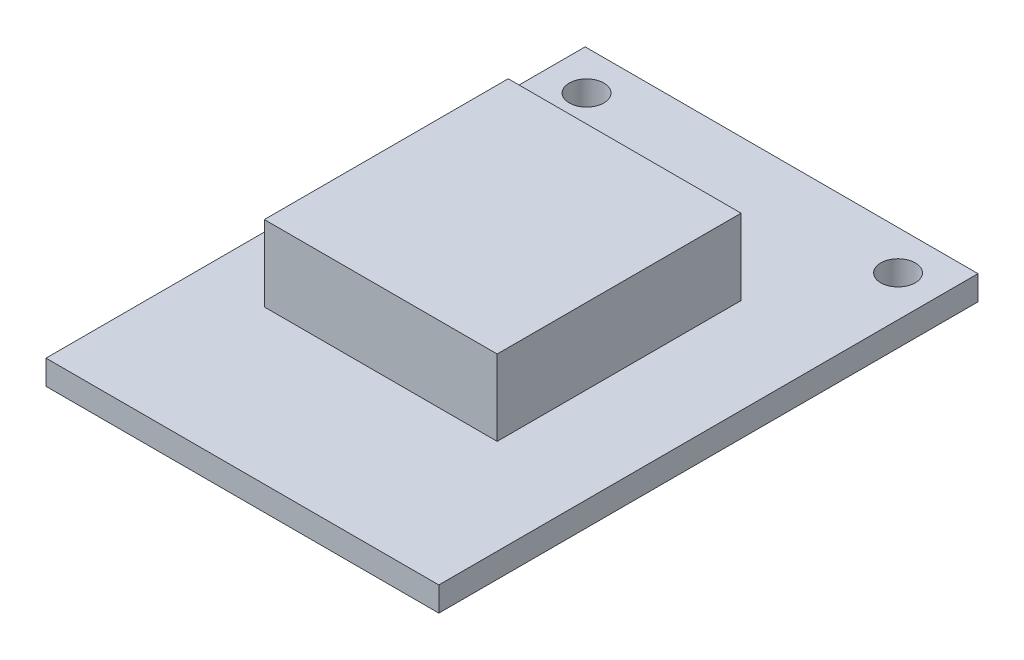
ISO-10303-21;
HEADER;
FILE_DESCRIPTION(('STEP AP214'),'2;1');
FILE_NAME('part.step','',(''),(''),'','','');
FILE_SCHEMA(('AUTOMOTIVE_DESIGN { 1 0 10303 214 1 1 1 1 }'));
ENDSEC;
DATA;
#1=APPLICATION_CONTEXT('core data for automotive mechanical design processes');
#2=APPLICATION_PROTOCOL_DEFINITION('international standard','automotive_design',2000,#1);
#3=PRODUCT_CONTEXT('',#1,'mechanical');
#4=PRODUCT('Part','Part','',(#3));
#5=PRODUCT_RELATED_PRODUCT_CATEGORY('part','',(#4));
#6=PRODUCT_DEFINITION_FORMATION('','',#4);
#7=PRODUCT_DEFINITION_CONTEXT('part definition',#1,'design');
#8=PRODUCT_DEFINITION('design','',#6,#7);
#9=PRODUCT_DEFINITION_SHAPE('','',#8);
#10=(LENGTH_UNIT() NAMED_UNIT(*) SI_UNIT(.MILLI.,.METRE.));
#11=(NAMED_UNIT(*) PLANE_ANGLE_UNIT() SI_UNIT($,.RADIAN.));
#12=(NAMED_UNIT(*) SI_UNIT($,.STERADIAN.) SOLID_ANGLE_UNIT());
#13=UNCERTAINTY_MEASURE_WITH_UNIT(LENGTH_MEASURE(1.E-05),#10,'distance_accuracy_value','');
#14=(GEOMETRIC_REPRESENTATION_CONTEXT(3) GLOBAL_UNCERTAINTY_ASSIGNED_CONTEXT((#13)) GLOBAL_UNIT_ASSIGNED_CONTEXT((#10,
#11,#12)) REPRESENTATION_CONTEXT('',''));
#15=CARTESIAN_POINT('',(0.,0.,0.));
#16=DIRECTION('',(0.,0.,1.));
#17=DIRECTION('',(1.,0.,0.));
#18=AXIS2_PLACEMENT_3D('',#15,#16,#17);
#19=CARTESIAN_POINT('',(0.,1.5875,0.));
#20=DIRECTION('',(0.,-1.,0.));
#21=DIRECTION('',(0.,0.,-1.));
#22=AXIS2_PLACEMENT_3D('',#19,#20,#21);
#23=PLANE('',#22);
#24=CARTESIAN_POINT('',(10.1100322033156,1.5875,-14.9494172084023));
#25=DIRECTION('',(0.,1.,0.));
#26=DIRECTION('',(0.,0.,1.));
#27=AXIS2_PLACEMENT_3D('',#24,#25,#26);
#28=CIRCLE('',#27,1.12255965392009);
#29=CARTESIAN_POINT('',(10.1100322033156,1.5875,-13.8268575544822));
#30=VERTEX_POINT('',#29);
#31=EDGE_CURVE('E295',#30,#30,#28,.T.);
#32=ORIENTED_EDGE('',*,*,#31,.F.);
#33=EDGE_LOOP('',(#32));
#34=FACE_BOUND('',#33,.T.);
#35=CARTESIAN_POINT('',(-10.1100322033156,1.5875,-14.9494172084023));
#36=DIRECTION('',(0.,1.,0.));
#37=DIRECTION('',(0.,0.,1.));
#38=AXIS2_PLACEMENT_3D('',#35,#36,#37);
#39=CIRCLE('',#38,1.12255965392009);
#40=CARTESIAN_POINT('',(-10.1100322033156,1.5875,-13.8268575544822));
#41=VERTEX_POINT('',#40);
#42=EDGE_CURVE('E299',#41,#41,#39,.T.);
#43=ORIENTED_EDGE('',*,*,#42,.F.);
#44=EDGE_LOOP('',(#43));
#45=FACE_BOUND('',#44,.T.);
#46=DIRECTION('',(0.,0.,-1.));
#47=VECTOR('',#46,1.);
#48=CARTESIAN_POINT('',(12.75,1.5875,17.5));
#49=LINE('',#48,#47);
#50=CARTESIAN_POINT('',(12.75,1.5875,17.5));
#51=VERTEX_POINT('',#50);
#52=CARTESIAN_POINT('',(12.75,1.5875,-17.5));
#53=VERTEX_POINT('',#52);
#54=EDGE_CURVE('E130',#51,#53,#49,.T.);
#55=ORIENTED_EDGE('',*,*,#54,.T.);
#56=DIRECTION('',(-1.,0.,0.));
#57=VECTOR('',#56,1.);
#58=CARTESIAN_POINT('',(-12.75,1.5875,-17.5));
#59=LINE('',#58,#57);
#60=CARTESIAN_POINT('',(-12.75,1.5875,-17.5));
#61=VERTEX_POINT('',#60);
#62=EDGE_CURVE('E133',#53,#61,#59,.T.);
#63=ORIENTED_EDGE('',*,*,#62,.T.);
#64=DIRECTION('',(0.,0.,1.));
#65=VECTOR('',#64,1.);
#66=CARTESIAN_POINT('',(-12.75,1.5875,17.5));
#67=LINE('',#66,#65);
#68=CARTESIAN_POINT('',(-12.75,1.5875,17.5));
#69=VERTEX_POINT('',#68);
#70=EDGE_CURVE('E136',#61,#69,#67,.T.);
#71=ORIENTED_EDGE('',*,*,#70,.T.);
#72=DIRECTION('',(1.,0.,0.));
#73=VECTOR('',#72,1.);
#74=CARTESIAN_POINT('',(-12.75,1.5875,17.5));
#75=LINE('',#74,#73);
#76=EDGE_CURVE('E138',#69,#51,#75,.T.);
#77=ORIENTED_EDGE('',*,*,#76,.T.);
#78=EDGE_LOOP('',(#55,#63,#71,#77));
#79=FACE_BOUND('',#78,.T.);
#80=DIRECTION('',(0.,0.,1.));
#81=VECTOR('',#80,1.);
#82=CARTESIAN_POINT('',(-8.54213997936741,1.5875,-8.29616212655841));
#83=LINE('',#82,#81);
#84=CARTESIAN_POINT('',(-8.54213997936741,1.5875,-8.29616212655841));
#85=VERTEX_POINT('',#84);
#86=CARTESIAN_POINT('',(-8.54213997936741,1.5875,7.53586694514873));
#87=VERTEX_POINT('',#86);
#88=EDGE_CURVE('E120',#85,#87,#83,.T.);
#89=ORIENTED_EDGE('',*,*,#88,.F.);
#90=DIRECTION('',(-1.,0.,0.));
#91=VECTOR('',#90,1.);
#92=CARTESIAN_POINT('',(-8.54213997936741,1.5875,-8.29616212655841));
#93=LINE('',#92,#91);
#94=CARTESIAN_POINT('',(6.57431715689533,1.5875,-8.29616212655841));
#95=VERTEX_POINT('',#94);
#96=EDGE_CURVE('E117',#95,#85,#93,.T.);
#97=ORIENTED_EDGE('',*,*,#96,.F.);
#98=DIRECTION('',(0.,0.,-1.));
#99=VECTOR('',#98,1.);
#100=CARTESIAN_POINT('',(6.57431715689533,1.5875,-8.29616212655841));
#101=LINE('',#100,#99);
#102=CARTESIAN_POINT('',(6.57431715689533,1.5875,7.53586694514873));
#103=VERTEX_POINT('',#102);
#104=EDGE_CURVE('E55',#103,#95,#101,.T.);
#105=ORIENTED_EDGE('',*,*,#104,.F.);
#106=DIRECTION('',(1.,0.,0.));
#107=VECTOR('',#106,1.);
#108=CARTESIAN_POINT('',(-8.54213997936741,1.5875,7.53586694514873));
#109=LINE('',#108,#107);
#110=EDGE_CURVE('E50',#87,#103,#109,.T.);
#111=ORIENTED_EDGE('',*,*,#110,.F.);
#112=EDGE_LOOP('',(#89,#97,#105,#111));
#113=FACE_BOUND('',#112,.T.);
#114=ADVANCED_FACE('F35',(#34,#45,#79,#113),#23,.F.);
#115=CARTESIAN_POINT('',(12.75,1.5875,17.5));
#116=DIRECTION('',(-1.,0.,0.));
#117=DIRECTION('',(0.,0.,1.));
#118=AXIS2_PLACEMENT_3D('',#115,#116,#117);
#119=PLANE('',#118);
#120=DIRECTION('',(0.,0.,-1.));
#121=VECTOR('',#120,1.);
#122=CARTESIAN_POINT('',(12.75,0.,17.5));
#123=LINE('',#122,#121);
#124=CARTESIAN_POINT('',(12.75,0.,17.5));
#125=VERTEX_POINT('',#124);
#126=CARTESIAN_POINT('',(12.75,0.,-17.5));
#127=VERTEX_POINT('',#126);
#128=EDGE_CURVE('E121',#125,#127,#123,.T.);
#129=ORIENTED_EDGE('',*,*,#128,.T.);
#130=DIRECTION('',(0.,-1.,0.));
#131=VECTOR('',#130,1.);
#132=CARTESIAN_POINT('',(12.75,1.5875,-17.5));
#133=LINE('',#132,#131);
#134=EDGE_CURVE('E11',#53,#127,#133,.T.);
#135=ORIENTED_EDGE('',*,*,#134,.F.);
#136=ORIENTED_EDGE('',*,*,#54,.F.);
#137=DIRECTION('',(0.,-1.,0.));
#138=VECTOR('',#137,1.);
#139=CARTESIAN_POINT('',(12.75,1.5875,17.5));
#140=LINE('',#139,#138);
#141=EDGE_CURVE('E139',#51,#125,#140,.T.);
#142=ORIENTED_EDGE('',*,*,#141,.T.);
#143=EDGE_LOOP('',(#129,#135,#136,#142));
#144=FACE_BOUND('',#143,.T.);
#145=ADVANCED_FACE('F37',(#144),#119,.F.);
#146=CARTESIAN_POINT('',(-12.75,1.5875,-17.5));
#147=DIRECTION('',(0.,0.,1.));
#148=DIRECTION('',(1.,0.,0.));
#149=AXIS2_PLACEMENT_3D('',#146,#147,#148);
#150=PLANE('',#149);
#151=DIRECTION('',(-1.,0.,0.));
#152=VECTOR('',#151,1.);
#153=CARTESIAN_POINT('',(-12.75,0.,-17.5));
#154=LINE('',#153,#152);
#155=CARTESIAN_POINT('',(-12.75,0.,-17.5));
#156=VERTEX_POINT('',#155);
#157=EDGE_CURVE('E124',#127,#156,#154,.T.);
#158=ORIENTED_EDGE('',*,*,#157,.T.);
#159=DIRECTION('',(0.,-1.,0.));
#160=VECTOR('',#159,1.);
#161=CARTESIAN_POINT('',(-12.75,1.5875,-17.5));
#162=LINE('',#161,#160);
#163=EDGE_CURVE('E43',#61,#156,#162,.T.);
#164=ORIENTED_EDGE('',*,*,#163,.F.);
#165=ORIENTED_EDGE('',*,*,#62,.F.);
#166=ORIENTED_EDGE('',*,*,#134,.T.);
#167=EDGE_LOOP('',(#158,#164,#165,#166));
#168=FACE_BOUND('',#167,.T.);
#169=ADVANCED_FACE('F169',(#168),#150,.F.);
#170=CARTESIAN_POINT('',(-12.75,1.5875,17.5));
#171=DIRECTION('',(1.,0.,0.));
#172=DIRECTION('',(0.,0.,-1.));
#173=AXIS2_PLACEMENT_3D('',#170,#171,#172);
#174=PLANE('',#173);
#175=DIRECTION('',(0.,0.,1.));
#176=VECTOR('',#175,1.);
#177=CARTESIAN_POINT('',(-12.75,0.,17.5));
#178=LINE('',#177,#176);
#179=CARTESIAN_POINT('',(-12.75,0.,17.5));
#180=VERTEX_POINT('',#179);
#181=EDGE_CURVE('E142',#156,#180,#178,.T.);
#182=ORIENTED_EDGE('',*,*,#181,.T.);
#183=DIRECTION('',(0.,-1.,0.));
#184=VECTOR('',#183,1.);
#185=CARTESIAN_POINT('',(-12.75,1.5875,17.5));
#186=LINE('',#185,#184);
#187=EDGE_CURVE('E147',#69,#180,#186,.T.);
#188=ORIENTED_EDGE('',*,*,#187,.F.);
#189=ORIENTED_EDGE('',*,*,#70,.F.);
#190=ORIENTED_EDGE('',*,*,#163,.T.);
#191=EDGE_LOOP('',(#182,#188,#189,#190));
#192=FACE_BOUND('',#191,.T.);
#193=ADVANCED_FACE('F154',(#192),#174,.F.);
#194=CARTESIAN_POINT('',(-12.75,1.5875,17.5));
#195=DIRECTION('',(0.,0.,-1.));
#196=DIRECTION('',(-1.,0.,0.));
#197=AXIS2_PLACEMENT_3D('',#194,#195,#196);
#198=PLANE('',#197);
#199=DIRECTION('',(1.,0.,0.));
#200=VECTOR('',#199,1.);
#201=CARTESIAN_POINT('',(-12.75,0.,17.5));
#202=LINE('',#201,#200);
#203=EDGE_CURVE('E134',#180,#125,#202,.T.);
#204=ORIENTED_EDGE('',*,*,#203,.T.);
#205=ORIENTED_EDGE('',*,*,#141,.F.);
#206=ORIENTED_EDGE('',*,*,#76,.F.);
#207=ORIENTED_EDGE('',*,*,#187,.T.);
#208=EDGE_LOOP('',(#204,#205,#206,#207));
#209=FACE_BOUND('',#208,.T.);
#210=ADVANCED_FACE('F163',(#209),#198,.F.);
#211=CARTESIAN_POINT('',(0.,0.,0.));
#212=DIRECTION('',(0.,-1.,0.));
#213=DIRECTION('',(0.,0.,-1.));
#214=AXIS2_PLACEMENT_3D('',#211,#212,#213);
#215=PLANE('',#214);
#216=CARTESIAN_POINT('',(10.1100322033156,0.,-14.9494172084023));
#217=DIRECTION('',(0.,-1.,0.));
#218=DIRECTION('',(0.,0.,-1.));
#219=AXIS2_PLACEMENT_3D('',#216,#217,#218);
#220=CIRCLE('',#219,1.12255965392009);
#221=CARTESIAN_POINT('',(10.1100322033156,0.,-16.0719768623224));
#222=VERTEX_POINT('',#221);
#223=EDGE_CURVE('E293',#222,#222,#220,.F.);
#224=ORIENTED_EDGE('',*,*,#223,.T.);
#225=EDGE_LOOP('',(#224));
#226=FACE_BOUND('',#225,.T.);
#227=CARTESIAN_POINT('',(-10.1100322033156,0.,-14.9494172084023));
#228=DIRECTION('',(0.,-1.,0.));
#229=DIRECTION('',(0.,0.,-1.));
#230=AXIS2_PLACEMENT_3D('',#227,#228,#229);
#231=CIRCLE('',#230,1.12255965392009);
#232=CARTESIAN_POINT('',(-10.1100322033156,0.,-16.0719768623224));
#233=VERTEX_POINT('',#232);
#234=EDGE_CURVE('E296',#233,#233,#231,.F.);
#235=ORIENTED_EDGE('',*,*,#234,.T.);
#236=EDGE_LOOP('',(#235));
#237=FACE_BOUND('',#236,.T.);
#238=ORIENTED_EDGE('',*,*,#128,.F.);
#239=ORIENTED_EDGE('',*,*,#203,.F.);
#240=ORIENTED_EDGE('',*,*,#181,.F.);
#241=ORIENTED_EDGE('',*,*,#157,.F.);
#242=EDGE_LOOP('',(#238,#239,#240,#241));
#243=FACE_BOUND('',#242,.T.);
#244=ADVANCED_FACE('F160',(#226,#237,#243),#215,.T.);
#245=CARTESIAN_POINT('',(-8.54213997936741,6.5,-8.29616212655841));
#246=DIRECTION('',(1.,0.,0.));
#247=DIRECTION('',(0.,0.,-1.));
#248=AXIS2_PLACEMENT_3D('',#245,#246,#247);
#249=PLANE('',#248);
#250=ORIENTED_EDGE('',*,*,#88,.T.);
#251=DIRECTION('',(0.,-1.,0.));
#252=VECTOR('',#251,1.);
#253=CARTESIAN_POINT('',(-8.54213997936741,6.5,7.53586694514873));
#254=LINE('',#253,#252);
#255=CARTESIAN_POINT('',(-8.54213997936741,6.5,7.53586694514873));
#256=VERTEX_POINT('',#255);
#257=EDGE_CURVE('E101',#256,#87,#254,.T.);
#258=ORIENTED_EDGE('',*,*,#257,.F.);
#259=DIRECTION('',(0.,0.,1.));
#260=VECTOR('',#259,1.);
#261=CARTESIAN_POINT('',(-8.54213997936741,6.5,-8.29616212655841));
#262=LINE('',#261,#260);
#263=CARTESIAN_POINT('',(-8.54213997936741,6.5,-8.29616212655841));
#264=VERTEX_POINT('',#263);
#265=EDGE_CURVE('E108',#264,#256,#262,.T.);
#266=ORIENTED_EDGE('',*,*,#265,.F.);
#267=DIRECTION('',(0.,-1.,0.));
#268=VECTOR('',#267,1.);
#269=CARTESIAN_POINT('',(-8.54213997936741,6.5,-8.29616212655841));
#270=LINE('',#269,#268);
#271=EDGE_CURVE('E307',#264,#85,#270,.T.);
#272=ORIENTED_EDGE('',*,*,#271,.T.);
#273=EDGE_LOOP('',(#250,#258,#266,#272));
#274=FACE_BOUND('',#273,.T.);
#275=ADVANCED_FACE('F119',(#274),#249,.F.);
#276=CARTESIAN_POINT('',(-8.54213997936741,6.5,7.53586694514873));
#277=DIRECTION('',(0.,0.,-1.));
#278=DIRECTION('',(-1.,0.,0.));
#279=AXIS2_PLACEMENT_3D('',#276,#277,#278);
#280=PLANE('',#279);
#281=ORIENTED_EDGE('',*,*,#110,.T.);
#282=DIRECTION('',(0.,-1.,0.));
#283=VECTOR('',#282,1.);
#284=CARTESIAN_POINT('',(6.57431715689533,6.5,7.53586694514873));
#285=LINE('',#284,#283);
#286=CARTESIAN_POINT('',(6.57431715689533,6.5,7.53586694514873));
#287=VERTEX_POINT('',#286);
#288=EDGE_CURVE('E104',#287,#103,#285,.T.);
#289=ORIENTED_EDGE('',*,*,#288,.F.);
#290=DIRECTION('',(1.,0.,0.));
#291=VECTOR('',#290,1.);
#292=CARTESIAN_POINT('',(-8.54213997936741,6.5,7.53586694514873));
#293=LINE('',#292,#291);
#294=EDGE_CURVE('E97',#256,#287,#293,.T.);
#295=ORIENTED_EDGE('',*,*,#294,.F.);
#296=ORIENTED_EDGE('',*,*,#257,.T.);
#297=EDGE_LOOP('',(#281,#289,#295,#296));
#298=FACE_BOUND('',#297,.T.);
#299=ADVANCED_FACE('F99',(#298),#280,.F.);
#300=CARTESIAN_POINT('',(6.57431715689533,6.5,-8.29616212655841));
#301=DIRECTION('',(-1.,0.,0.));
#302=DIRECTION('',(0.,0.,1.));
#303=AXIS2_PLACEMENT_3D('',#300,#301,#302);
#304=PLANE('',#303);
#305=ORIENTED_EDGE('',*,*,#104,.T.);
#306=DIRECTION('',(0.,-1.,0.));
#307=VECTOR('',#306,1.);
#308=CARTESIAN_POINT('',(6.57431715689533,6.5,-8.29616212655841));
#309=LINE('',#308,#307);
#310=CARTESIAN_POINT('',(6.57431715689533,6.5,-8.29616212655841));
#311=VERTEX_POINT('',#310);
#312=EDGE_CURVE('E126',#311,#95,#309,.T.);
#313=ORIENTED_EDGE('',*,*,#312,.F.);
#314=DIRECTION('',(0.,0.,-1.));
#315=VECTOR('',#314,1.);
#316=CARTESIAN_POINT('',(6.57431715689533,6.5,-8.29616212655841));
#317=LINE('',#316,#315);
#318=EDGE_CURVE('E107',#287,#311,#317,.T.);
#319=ORIENTED_EDGE('',*,*,#318,.F.);
#320=ORIENTED_EDGE('',*,*,#288,.T.);
#321=EDGE_LOOP('',(#305,#313,#319,#320));
#322=FACE_BOUND('',#321,.T.);
#323=ADVANCED_FACE('F210',(#322),#304,.F.);
#324=CARTESIAN_POINT('',(-8.54213997936741,6.5,-8.29616212655841));
#325=DIRECTION('',(0.,0.,1.));
#326=DIRECTION('',(1.,0.,0.));
#327=AXIS2_PLACEMENT_3D('',#324,#325,#326);
#328=PLANE('',#327);
#329=ORIENTED_EDGE('',*,*,#96,.T.);
#330=ORIENTED_EDGE('',*,*,#271,.F.);
#331=DIRECTION('',(-1.,0.,0.));
#332=VECTOR('',#331,1.);
#333=CARTESIAN_POINT('',(-8.54213997936741,6.5,-8.29616212655841));
#334=LINE('',#333,#332);
#335=EDGE_CURVE('E113',#311,#264,#334,.T.);
#336=ORIENTED_EDGE('',*,*,#335,.F.);
#337=ORIENTED_EDGE('',*,*,#312,.T.);
#338=EDGE_LOOP('',(#329,#330,#336,#337));
#339=FACE_BOUND('',#338,.T.);
#340=ADVANCED_FACE('F216',(#339),#328,.F.);
#341=CARTESIAN_POINT('',(0.,6.5,0.));
#342=DIRECTION('',(0.,1.,0.));
#343=DIRECTION('',(0.,0.,1.));
#344=AXIS2_PLACEMENT_3D('',#341,#342,#343);
#345=PLANE('',#344);
#346=ORIENTED_EDGE('',*,*,#265,.T.);
#347=ORIENTED_EDGE('',*,*,#294,.T.);
#348=ORIENTED_EDGE('',*,*,#318,.T.);
#349=ORIENTED_EDGE('',*,*,#335,.T.);
#350=EDGE_LOOP('',(#346,#347,#348,#349));
#351=FACE_BOUND('',#350,.T.);
#352=ADVANCED_FACE('F111',(#351),#345,.T.);
#353=CARTESIAN_POINT('',(-10.1100322033156,-0.000999999999999916,-14.9494172084023));
#354=DIRECTION('',(0.,1.,0.));
#355=DIRECTION('',(0.,0.,1.));
#356=AXIS2_PLACEMENT_3D('',#353,#354,#355);
#357=CYLINDRICAL_SURFACE('',#356,1.12255965392009);
#358=ORIENTED_EDGE('',*,*,#234,.F.);
#359=EDGE_LOOP('',(#358));
#360=FACE_BOUND('',#359,.T.);
#361=ORIENTED_EDGE('',*,*,#42,.T.);
#362=EDGE_LOOP('',(#361));
#363=FACE_BOUND('',#362,.T.);
#364=ADVANCED_FACE('F231',(#360,#363),#357,.F.);
#365=CARTESIAN_POINT('',(10.1100322033156,-0.000999999999999916,-14.9494172084023));
#366=DIRECTION('',(0.,1.,0.));
#367=DIRECTION('',(0.,0.,1.));
#368=AXIS2_PLACEMENT_3D('',#365,#366,#367);
#369=CYLINDRICAL_SURFACE('',#368,1.12255965392009);
#370=ORIENTED_EDGE('',*,*,#223,.F.);
#371=EDGE_LOOP('',(#370));
#372=FACE_BOUND('',#371,.T.);
#373=ORIENTED_EDGE('',*,*,#31,.T.);
#374=EDGE_LOOP('',(#373));
#375=FACE_BOUND('',#374,.T.);
#376=ADVANCED_FACE('F237',(#372,#375),#369,.F.);
#377=CLOSED_SHELL('',(#114,#145,#169,#193,#210,#244,#275,#299,#323,#340,#352,#364,#376));
#378=MANIFOLD_SOLID_BREP('B2',#377);
#379=ADVANCED_BREP_SHAPE_REPRESENTATION('',(#18,#378),#14);
#380=SHAPE_DEFINITION_REPRESENTATION(#9,#379);
ENDSEC;
END-ISO-10303-21;
